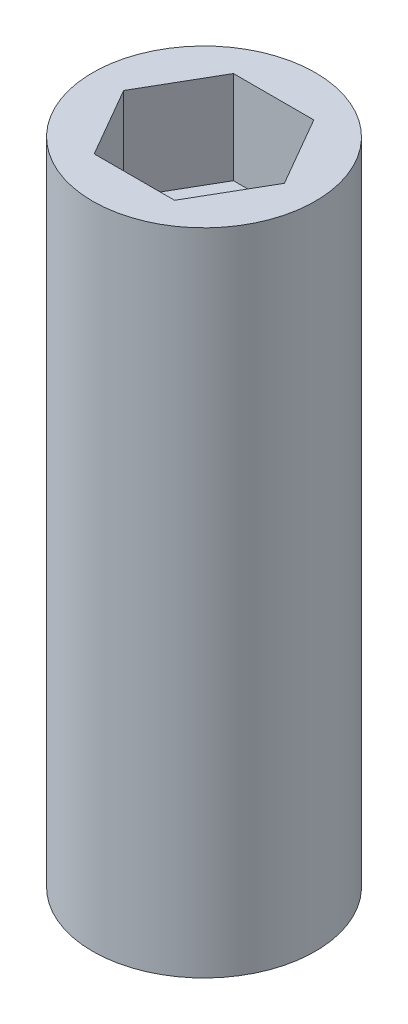
ISO-10303-21;
HEADER;
FILE_DESCRIPTION(('STEP AP214'),'2;1');
FILE_NAME('part.step','',(''),(''),'','','');
FILE_SCHEMA(('AUTOMOTIVE_DESIGN { 1 0 10303 214 1 1 1 1 }'));
ENDSEC;
DATA;
#1=APPLICATION_CONTEXT('core data for automotive mechanical design processes');
#2=APPLICATION_PROTOCOL_DEFINITION('international standard','automotive_design',2000,#1);
#3=PRODUCT_CONTEXT('',#1,'mechanical');
#4=PRODUCT('Part','Part','',(#3));
#5=PRODUCT_RELATED_PRODUCT_CATEGORY('part','',(#4));
#6=PRODUCT_DEFINITION_FORMATION('','',#4);
#7=PRODUCT_DEFINITION_CONTEXT('part definition',#1,'design');
#8=PRODUCT_DEFINITION('design','',#6,#7);
#9=PRODUCT_DEFINITION_SHAPE('','',#8);
#10=(LENGTH_UNIT() NAMED_UNIT(*) SI_UNIT(.MILLI.,.METRE.));
#11=(NAMED_UNIT(*) PLANE_ANGLE_UNIT() SI_UNIT($,.RADIAN.));
#12=(NAMED_UNIT(*) SI_UNIT($,.STERADIAN.) SOLID_ANGLE_UNIT());
#13=UNCERTAINTY_MEASURE_WITH_UNIT(LENGTH_MEASURE(1.E-05),#10,'distance_accuracy_value','');
#14=(GEOMETRIC_REPRESENTATION_CONTEXT(3) GLOBAL_UNCERTAINTY_ASSIGNED_CONTEXT((#13)) GLOBAL_UNIT_ASSIGNED_CONTEXT((#10,
#11,#12)) REPRESENTATION_CONTEXT('',''));
#15=CARTESIAN_POINT('',(0.,0.,0.));
#16=DIRECTION('',(0.,0.,1.));
#17=DIRECTION('',(1.,0.,0.));
#18=AXIS2_PLACEMENT_3D('',#15,#16,#17);
#19=CARTESIAN_POINT('',(0.,7.,0.));
#20=DIRECTION('',(0.,-1.,0.));
#21=DIRECTION('',(0.,0.,-1.));
#22=AXIS2_PLACEMENT_3D('',#19,#20,#21);
#23=CYLINDRICAL_SURFACE('',#22,1.2);
#24=CARTESIAN_POINT('',(0.,7.,0.));
#25=DIRECTION('',(0.,1.,0.));
#26=DIRECTION('',(0.,0.,1.));
#27=AXIS2_PLACEMENT_3D('',#24,#25,#26);
#28=CIRCLE('',#27,1.2);
#29=CARTESIAN_POINT('',(0.,7.,1.2));
#30=VERTEX_POINT('',#29);
#31=EDGE_CURVE('E11',#30,#30,#28,.T.);
#32=ORIENTED_EDGE('',*,*,#31,.F.);
#33=EDGE_LOOP('',(#32));
#34=FACE_BOUND('',#33,.T.);
#35=CARTESIAN_POINT('',(0.,0.,0.));
#36=DIRECTION('',(0.,1.,0.));
#37=DIRECTION('',(0.,0.,1.));
#38=AXIS2_PLACEMENT_3D('',#35,#36,#37);
#39=CIRCLE('',#38,1.2);
#40=CARTESIAN_POINT('',(0.,0.,1.2));
#41=VERTEX_POINT('',#40);
#42=EDGE_CURVE('E40',#41,#41,#39,.T.);
#43=ORIENTED_EDGE('',*,*,#42,.T.);
#44=EDGE_LOOP('',(#43));
#45=FACE_BOUND('',#44,.T.);
#46=ADVANCED_FACE('F37',(#34,#45),#23,.T.);
#47=CARTESIAN_POINT('',(0.,7.,0.));
#48=DIRECTION('',(0.,1.,0.));
#49=DIRECTION('',(0.,0.,1.));
#50=AXIS2_PLACEMENT_3D('',#47,#48,#49);
#51=PLANE('',#50);
#52=DIRECTION('',(0.5,0.,-0.866025403784439));
#53=VECTOR('',#52,1.);
#54=CARTESIAN_POINT('',(0.433012701892219,7.,0.750000000000001));
#55=LINE('',#54,#53);
#56=CARTESIAN_POINT('',(0.433012701892219,7.,0.750000000000001));
#57=VERTEX_POINT('',#56);
#58=CARTESIAN_POINT('',(0.866025403784439,7.,0.));
#59=VERTEX_POINT('',#58);
#60=EDGE_CURVE('E51',#57,#59,#55,.T.);
#61=ORIENTED_EDGE('',*,*,#60,.F.);
#62=DIRECTION('',(1.,0.,0.));
#63=VECTOR('',#62,1.);
#64=CARTESIAN_POINT('',(-0.43301270189222,7.,0.75));
#65=LINE('',#64,#63);
#66=CARTESIAN_POINT('',(-0.43301270189222,7.,0.75));
#67=VERTEX_POINT('',#66);
#68=EDGE_CURVE('E134',#67,#57,#65,.T.);
#69=ORIENTED_EDGE('',*,*,#68,.F.);
#70=DIRECTION('',(0.5,0.,0.866025403784439));
#71=VECTOR('',#70,1.);
#72=CARTESIAN_POINT('',(-0.866025403784439,7.,0.));
#73=LINE('',#72,#71);
#74=CARTESIAN_POINT('',(-0.866025403784439,7.,0.));
#75=VERTEX_POINT('',#74);
#76=EDGE_CURVE('E132',#75,#67,#73,.T.);
#77=ORIENTED_EDGE('',*,*,#76,.F.);
#78=DIRECTION('',(-0.5,0.,0.866025403784439));
#79=VECTOR('',#78,1.);
#80=CARTESIAN_POINT('',(-0.43301270189222,7.,-0.750000000000001));
#81=LINE('',#80,#79);
#82=CARTESIAN_POINT('',(-0.43301270189222,7.,-0.750000000000001));
#83=VERTEX_POINT('',#82);
#84=EDGE_CURVE('E99',#83,#75,#81,.T.);
#85=ORIENTED_EDGE('',*,*,#84,.F.);
#86=DIRECTION('',(-1.,0.,0.));
#87=VECTOR('',#86,1.);
#88=CARTESIAN_POINT('',(0.433012701892219,7.,-0.750000000000001));
#89=LINE('',#88,#87);
#90=CARTESIAN_POINT('',(0.433012701892219,7.,-0.750000000000001));
#91=VERTEX_POINT('',#90);
#92=EDGE_CURVE('E128',#91,#83,#89,.T.);
#93=ORIENTED_EDGE('',*,*,#92,.F.);
#94=DIRECTION('',(-0.5,0.,-0.866025403784439));
#95=VECTOR('',#94,1.);
#96=CARTESIAN_POINT('',(0.866025403784439,7.,0.));
#97=LINE('',#96,#95);
#98=EDGE_CURVE('E125',#59,#91,#97,.T.);
#99=ORIENTED_EDGE('',*,*,#98,.F.);
#100=EDGE_LOOP('',(#61,#69,#77,#85,#93,#99));
#101=FACE_BOUND('',#100,.T.);
#102=ORIENTED_EDGE('',*,*,#31,.T.);
#103=EDGE_LOOP('',(#102));
#104=FACE_BOUND('',#103,.T.);
#105=ADVANCED_FACE('F147',(#101,#104),#51,.T.);
#106=CARTESIAN_POINT('',(0.,0.,0.));
#107=DIRECTION('',(0.,1.,0.));
#108=DIRECTION('',(0.,0.,1.));
#109=AXIS2_PLACEMENT_3D('',#106,#107,#108);
#110=PLANE('',#109);
#111=ORIENTED_EDGE('',*,*,#42,.F.);
#112=EDGE_LOOP('',(#111));
#113=FACE_BOUND('',#112,.T.);
#114=ADVANCED_FACE('F156',(#113),#110,.F.);
#115=CARTESIAN_POINT('',(0.433012701892219,6.,0.750000000000001));
#116=DIRECTION('',(0.866025403784439,0.,0.5));
#117=DIRECTION('',(0.5,0.,-0.866025403784439));
#118=AXIS2_PLACEMENT_3D('',#115,#116,#117);
#119=PLANE('',#118);
#120=ORIENTED_EDGE('',*,*,#60,.T.);
#121=DIRECTION('',(0.,1.,0.));
#122=VECTOR('',#121,1.);
#123=CARTESIAN_POINT('',(0.866025403784439,6.,0.));
#124=LINE('',#123,#122);
#125=CARTESIAN_POINT('',(0.866025403784439,6.,0.));
#126=VERTEX_POINT('',#125);
#127=EDGE_CURVE('E81',#126,#59,#124,.T.);
#128=ORIENTED_EDGE('',*,*,#127,.F.);
#129=DIRECTION('',(0.5,0.,-0.866025403784439));
#130=VECTOR('',#129,1.);
#131=CARTESIAN_POINT('',(0.433012701892219,6.,0.750000000000001));
#132=LINE('',#131,#130);
#133=CARTESIAN_POINT('',(0.433012701892219,6.,0.750000000000001));
#134=VERTEX_POINT('',#133);
#135=EDGE_CURVE('E136',#134,#126,#132,.T.);
#136=ORIENTED_EDGE('',*,*,#135,.F.);
#137=DIRECTION('',(0.,1.,0.));
#138=VECTOR('',#137,1.);
#139=CARTESIAN_POINT('',(0.433012701892219,6.,0.750000000000001));
#140=LINE('',#139,#138);
#141=EDGE_CURVE('E59',#134,#57,#140,.T.);
#142=ORIENTED_EDGE('',*,*,#141,.T.);
#143=EDGE_LOOP('',(#120,#128,#136,#142));
#144=FACE_BOUND('',#143,.T.);
#145=ADVANCED_FACE('F153',(#144),#119,.F.);
#146=CARTESIAN_POINT('',(-0.43301270189222,6.,0.75));
#147=DIRECTION('',(0.,0.,1.));
#148=DIRECTION('',(1.,0.,0.));
#149=AXIS2_PLACEMENT_3D('',#146,#147,#148);
#150=PLANE('',#149);
#151=ORIENTED_EDGE('',*,*,#68,.T.);
#152=ORIENTED_EDGE('',*,*,#141,.F.);
#153=DIRECTION('',(1.,0.,0.));
#154=VECTOR('',#153,1.);
#155=CARTESIAN_POINT('',(-0.43301270189222,6.,0.75));
#156=LINE('',#155,#154);
#157=CARTESIAN_POINT('',(-0.43301270189222,6.,0.75));
#158=VERTEX_POINT('',#157);
#159=EDGE_CURVE('E111',#158,#134,#156,.T.);
#160=ORIENTED_EDGE('',*,*,#159,.F.);
#161=DIRECTION('',(0.,1.,0.));
#162=VECTOR('',#161,1.);
#163=CARTESIAN_POINT('',(-0.43301270189222,6.,0.75));
#164=LINE('',#163,#162);
#165=EDGE_CURVE('E103',#158,#67,#164,.T.);
#166=ORIENTED_EDGE('',*,*,#165,.T.);
#167=EDGE_LOOP('',(#151,#152,#160,#166));
#168=FACE_BOUND('',#167,.T.);
#169=ADVANCED_FACE('F155',(#168),#150,.F.);
#170=CARTESIAN_POINT('',(-0.866025403784439,6.,0.));
#171=DIRECTION('',(-0.866025403784439,0.,0.5));
#172=DIRECTION('',(0.5,0.,0.866025403784439));
#173=AXIS2_PLACEMENT_3D('',#170,#171,#172);
#174=PLANE('',#173);
#175=ORIENTED_EDGE('',*,*,#76,.T.);
#176=ORIENTED_EDGE('',*,*,#165,.F.);
#177=DIRECTION('',(0.5,0.,0.866025403784439));
#178=VECTOR('',#177,1.);
#179=CARTESIAN_POINT('',(-0.866025403784439,6.,0.));
#180=LINE('',#179,#178);
#181=CARTESIAN_POINT('',(-0.866025403784439,6.,0.));
#182=VERTEX_POINT('',#181);
#183=EDGE_CURVE('E107',#182,#158,#180,.T.);
#184=ORIENTED_EDGE('',*,*,#183,.F.);
#185=DIRECTION('',(0.,1.,0.));
#186=VECTOR('',#185,1.);
#187=CARTESIAN_POINT('',(-0.866025403784439,6.,0.));
#188=LINE('',#187,#186);
#189=EDGE_CURVE('E92',#182,#75,#188,.T.);
#190=ORIENTED_EDGE('',*,*,#189,.T.);
#191=EDGE_LOOP('',(#175,#176,#184,#190));
#192=FACE_BOUND('',#191,.T.);
#193=ADVANCED_FACE('F108',(#192),#174,.F.);
#194=CARTESIAN_POINT('',(-0.43301270189222,6.,-0.750000000000001));
#195=DIRECTION('',(-0.866025403784439,0.,-0.5));
#196=DIRECTION('',(-0.5,0.,0.866025403784439));
#197=AXIS2_PLACEMENT_3D('',#194,#195,#196);
#198=PLANE('',#197);
#199=ORIENTED_EDGE('',*,*,#84,.T.);
#200=ORIENTED_EDGE('',*,*,#189,.F.);
#201=DIRECTION('',(-0.5,0.,0.866025403784439));
#202=VECTOR('',#201,1.);
#203=CARTESIAN_POINT('',(-0.43301270189222,6.,-0.750000000000001));
#204=LINE('',#203,#202);
#205=CARTESIAN_POINT('',(-0.43301270189222,6.,-0.750000000000001));
#206=VERTEX_POINT('',#205);
#207=EDGE_CURVE('E96',#206,#182,#204,.T.);
#208=ORIENTED_EDGE('',*,*,#207,.F.);
#209=DIRECTION('',(0.,1.,0.));
#210=VECTOR('',#209,1.);
#211=CARTESIAN_POINT('',(-0.43301270189222,6.,-0.750000000000001));
#212=LINE('',#211,#210);
#213=EDGE_CURVE('E104',#206,#83,#212,.T.);
#214=ORIENTED_EDGE('',*,*,#213,.T.);
#215=EDGE_LOOP('',(#199,#200,#208,#214));
#216=FACE_BOUND('',#215,.T.);
#217=ADVANCED_FACE('F94',(#216),#198,.F.);
#218=CARTESIAN_POINT('',(0.433012701892219,6.,-0.750000000000001));
#219=DIRECTION('',(0.,0.,-1.));
#220=DIRECTION('',(-1.,0.,0.));
#221=AXIS2_PLACEMENT_3D('',#218,#219,#220);
#222=PLANE('',#221);
#223=ORIENTED_EDGE('',*,*,#92,.T.);
#224=ORIENTED_EDGE('',*,*,#213,.F.);
#225=DIRECTION('',(-1.,0.,0.));
#226=VECTOR('',#225,1.);
#227=CARTESIAN_POINT('',(0.433012701892219,6.,-0.750000000000001));
#228=LINE('',#227,#226);
#229=CARTESIAN_POINT('',(0.433012701892219,6.,-0.750000000000001));
#230=VERTEX_POINT('',#229);
#231=EDGE_CURVE('E117',#230,#206,#228,.T.);
#232=ORIENTED_EDGE('',*,*,#231,.F.);
#233=DIRECTION('',(0.,1.,0.));
#234=VECTOR('',#233,1.);
#235=CARTESIAN_POINT('',(0.433012701892219,6.,-0.750000000000001));
#236=LINE('',#235,#234);
#237=EDGE_CURVE('E140',#230,#91,#236,.T.);
#238=ORIENTED_EDGE('',*,*,#237,.T.);
#239=EDGE_LOOP('',(#223,#224,#232,#238));
#240=FACE_BOUND('',#239,.T.);
#241=ADVANCED_FACE('F151',(#240),#222,.F.);
#242=CARTESIAN_POINT('',(0.866025403784439,6.,0.));
#243=DIRECTION('',(0.866025403784439,0.,-0.5));
#244=DIRECTION('',(-0.5,0.,-0.866025403784439));
#245=AXIS2_PLACEMENT_3D('',#242,#243,#244);
#246=PLANE('',#245);
#247=ORIENTED_EDGE('',*,*,#98,.T.);
#248=ORIENTED_EDGE('',*,*,#237,.F.);
#249=DIRECTION('',(-0.5,0.,-0.866025403784439));
#250=VECTOR('',#249,1.);
#251=CARTESIAN_POINT('',(0.866025403784439,6.,0.));
#252=LINE('',#251,#250);
#253=EDGE_CURVE('E119',#126,#230,#252,.T.);
#254=ORIENTED_EDGE('',*,*,#253,.F.);
#255=ORIENTED_EDGE('',*,*,#127,.T.);
#256=EDGE_LOOP('',(#247,#248,#254,#255));
#257=FACE_BOUND('',#256,.T.);
#258=ADVANCED_FACE('F144',(#257),#246,.F.);
#259=CARTESIAN_POINT('',(0.,6.,0.));
#260=DIRECTION('',(0.,1.,0.));
#261=DIRECTION('',(0.,0.,1.));
#262=AXIS2_PLACEMENT_3D('',#259,#260,#261);
#263=PLANE('',#262);
#264=ORIENTED_EDGE('',*,*,#135,.T.);
#265=ORIENTED_EDGE('',*,*,#253,.T.);
#266=ORIENTED_EDGE('',*,*,#231,.T.);
#267=ORIENTED_EDGE('',*,*,#207,.T.);
#268=ORIENTED_EDGE('',*,*,#183,.T.);
#269=ORIENTED_EDGE('',*,*,#159,.T.);
#270=EDGE_LOOP('',(#264,#265,#266,#267,#268,#269));
#271=FACE_BOUND('',#270,.T.);
#272=ADVANCED_FACE('F114',(#271),#263,.T.);
#273=CLOSED_SHELL('',(#46,#105,#114,#145,#169,#193,#217,#241,#258,#272));
#274=MANIFOLD_SOLID_BREP('B2',#273);
#275=ADVANCED_BREP_SHAPE_REPRESENTATION('',(#18,#274),#14);
#276=SHAPE_DEFINITION_REPRESENTATION(#9,#275);
ENDSEC;
END-ISO-10303-21;
